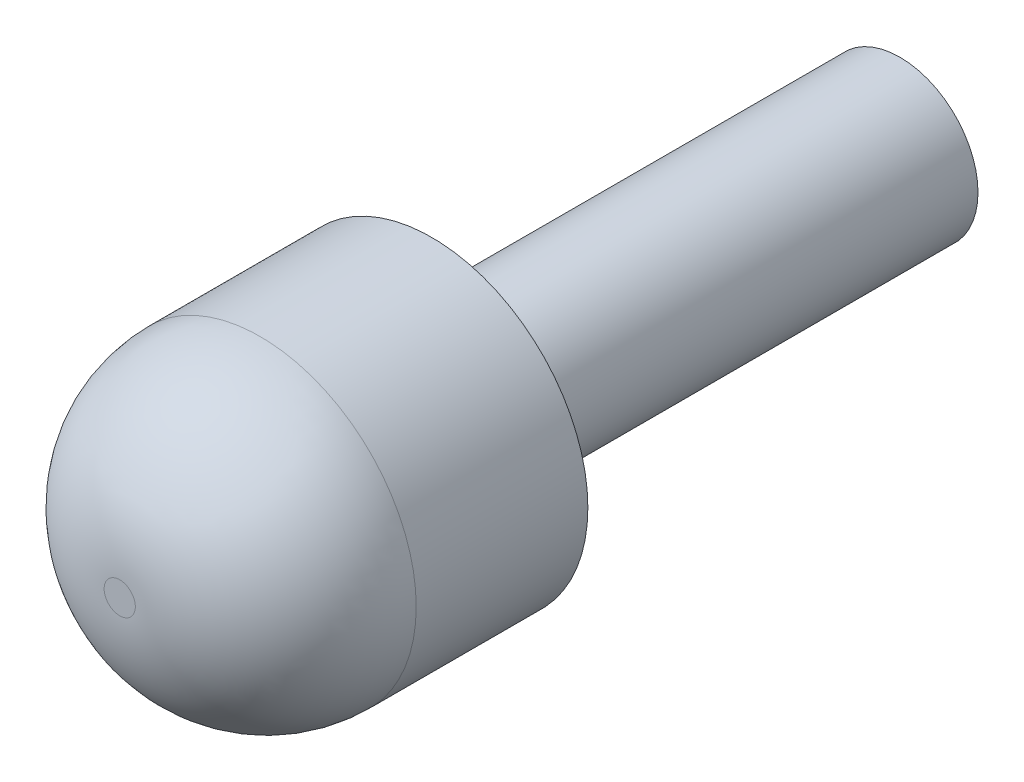
ISO-10303-21;
HEADER;
FILE_DESCRIPTION(('STEP AP214'),'2;1');
FILE_NAME('part.step','',(''),(''),'','','');
FILE_SCHEMA(('AUTOMOTIVE_DESIGN { 1 0 10303 214 1 1 1 1 }'));
ENDSEC;
DATA;
#1=APPLICATION_CONTEXT('core data for automotive mechanical design processes');
#2=APPLICATION_PROTOCOL_DEFINITION('international standard','automotive_design',2000,#1);
#3=PRODUCT_CONTEXT('',#1,'mechanical');
#4=PRODUCT('Part','Part','',(#3));
#5=PRODUCT_RELATED_PRODUCT_CATEGORY('part','',(#4));
#6=PRODUCT_DEFINITION_FORMATION('','',#4);
#7=PRODUCT_DEFINITION_CONTEXT('part definition',#1,'design');
#8=PRODUCT_DEFINITION('design','',#6,#7);
#9=PRODUCT_DEFINITION_SHAPE('','',#8);
#10=(LENGTH_UNIT() NAMED_UNIT(*) SI_UNIT(.MILLI.,.METRE.));
#11=(NAMED_UNIT(*) PLANE_ANGLE_UNIT() SI_UNIT($,.RADIAN.));
#12=(NAMED_UNIT(*) SI_UNIT($,.STERADIAN.) SOLID_ANGLE_UNIT());
#13=UNCERTAINTY_MEASURE_WITH_UNIT(LENGTH_MEASURE(1.E-05),#10,'distance_accuracy_value','');
#14=(GEOMETRIC_REPRESENTATION_CONTEXT(3) GLOBAL_UNCERTAINTY_ASSIGNED_CONTEXT((#13)) GLOBAL_UNIT_ASSIGNED_CONTEXT((#10,
#11,#12)) REPRESENTATION_CONTEXT('',''));
#15=CARTESIAN_POINT('',(0.,0.,0.));
#16=DIRECTION('',(0.,0.,1.));
#17=DIRECTION('',(1.,0.,0.));
#18=AXIS2_PLACEMENT_3D('',#15,#16,#17);
#19=CARTESIAN_POINT('',(0.,0.,-4.));
#20=DIRECTION('',(0.,0.,1.));
#21=DIRECTION('',(1.,0.,0.));
#22=AXIS2_PLACEMENT_3D('',#19,#20,#21);
#23=PLANE('',#22);
#24=CARTESIAN_POINT('',(0.,0.,-4.));
#25=DIRECTION('',(0.,0.,1.));
#26=DIRECTION('',(1.,0.,0.));
#27=AXIS2_PLACEMENT_3D('',#24,#25,#26);
#28=CIRCLE('',#27,2.);
#29=CARTESIAN_POINT('',(2.,0.,-4.));
#30=VERTEX_POINT('',#29);
#31=EDGE_CURVE('E117',#30,#30,#28,.T.);
#32=ORIENTED_EDGE('',*,*,#31,.F.);
#33=EDGE_LOOP('',(#32));
#34=FACE_BOUND('',#33,.T.);
#35=CARTESIAN_POINT('',(0.,0.,-4.));
#36=DIRECTION('',(0.,0.,1.));
#37=DIRECTION('',(1.,0.,0.));
#38=AXIS2_PLACEMENT_3D('',#35,#36,#37);
#39=CIRCLE('',#38,1.);
#40=CARTESIAN_POINT('',(1.,0.,-4.));
#41=VERTEX_POINT('',#40);
#42=EDGE_CURVE('E11',#41,#41,#39,.F.);
#43=ORIENTED_EDGE('',*,*,#42,.F.);
#44=EDGE_LOOP('',(#43));
#45=FACE_BOUND('',#44,.T.);
#46=ADVANCED_FACE('F36',(#34,#45),#23,.F.);
#47=CARTESIAN_POINT('',(0.,0.,-4.));
#48=DIRECTION('',(0.,0.,1.));
#49=DIRECTION('',(1.,0.,0.));
#50=AXIS2_PLACEMENT_3D('',#47,#48,#49);
#51=CYLINDRICAL_SURFACE('',#50,2.);
#52=CARTESIAN_POINT('',(0.,0.,-1.8));
#53=DIRECTION('',(0.,0.,1.));
#54=DIRECTION('',(1.,0.,0.));
#55=AXIS2_PLACEMENT_3D('',#52,#53,#54);
#56=CIRCLE('',#55,2.);
#57=CARTESIAN_POINT('',(2.,0.,-1.8));
#58=VERTEX_POINT('',#57);
#59=EDGE_CURVE('E44',#58,#58,#56,.F.);
#60=ORIENTED_EDGE('',*,*,#59,.T.);
#61=EDGE_LOOP('',(#60));
#62=FACE_BOUND('',#61,.T.);
#63=ORIENTED_EDGE('',*,*,#31,.T.);
#64=EDGE_LOOP('',(#63));
#65=FACE_BOUND('',#64,.T.);
#66=ADVANCED_FACE('F125',(#62,#65),#51,.T.);
#67=CARTESIAN_POINT('',(0.,0.,0.));
#68=DIRECTION('',(0.,0.,1.));
#69=DIRECTION('',(1.,0.,0.));
#70=AXIS2_PLACEMENT_3D('',#67,#68,#69);
#71=PLANE('',#70);
#72=CARTESIAN_POINT('',(0.,0.,0.));
#73=DIRECTION('',(0.,0.,1.));
#74=DIRECTION('',(1.,0.,0.));
#75=AXIS2_PLACEMENT_3D('',#72,#73,#74);
#76=CIRCLE('',#75,0.2);
#77=CARTESIAN_POINT('',(0.2,0.,0.));
#78=VERTEX_POINT('',#77);
#79=EDGE_CURVE('E120',#78,#78,#76,.T.);
#80=ORIENTED_EDGE('',*,*,#79,.T.);
#81=EDGE_LOOP('',(#80));
#82=FACE_BOUND('',#81,.T.);
#83=ADVANCED_FACE('F131',(#82),#71,.T.);
#84=CARTESIAN_POINT('',(0.,0.,-1.8));
#85=DIRECTION('',(0.,0.,1.));
#86=DIRECTION('',(1.,0.,0.));
#87=AXIS2_PLACEMENT_3D('',#84,#85,#86);
#88=DEGENERATE_TOROIDAL_SURFACE('',#87,0.2,1.8,.T.);
#89=ORIENTED_EDGE('',*,*,#59,.F.);
#90=EDGE_LOOP('',(#89));
#91=FACE_BOUND('',#90,.T.);
#92=ORIENTED_EDGE('',*,*,#79,.F.);
#93=EDGE_LOOP('',(#92));
#94=FACE_BOUND('',#93,.T.);
#95=ADVANCED_FACE('F38',(#91,#94),#88,.T.);
#96=CARTESIAN_POINT('',(0.,0.,-10.));
#97=DIRECTION('',(0.,0.,1.));
#98=DIRECTION('',(1.,0.,0.));
#99=AXIS2_PLACEMENT_3D('',#96,#97,#98);
#100=CYLINDRICAL_SURFACE('',#99,1.);
#101=CARTESIAN_POINT('',(0.,0.,-10.));
#102=DIRECTION('',(0.,0.,-1.));
#103=DIRECTION('',(-1.,0.,0.));
#104=AXIS2_PLACEMENT_3D('',#101,#102,#103);
#105=CIRCLE('',#104,1.);
#106=CARTESIAN_POINT('',(-1.,0.,-10.));
#107=VERTEX_POINT('',#106);
#108=EDGE_CURVE('E112',#107,#107,#105,.T.);
#109=ORIENTED_EDGE('',*,*,#108,.F.);
#110=EDGE_LOOP('',(#109));
#111=FACE_BOUND('',#110,.T.);
#112=ORIENTED_EDGE('',*,*,#42,.T.);
#113=EDGE_LOOP('',(#112));
#114=FACE_BOUND('',#113,.T.);
#115=ADVANCED_FACE('F130',(#111,#114),#100,.T.);
#116=CARTESIAN_POINT('',(0.,0.,-10.));
#117=DIRECTION('',(0.,0.,-1.));
#118=DIRECTION('',(-1.,0.,0.));
#119=AXIS2_PLACEMENT_3D('',#116,#117,#118);
#120=PLANE('',#119);
#121=DIRECTION('',(0.,-1.,0.));
#122=VECTOR('',#121,1.);
#123=CARTESIAN_POINT('',(0.5,-0.5,-10.));
#124=LINE('',#123,#122);
#125=CARTESIAN_POINT('',(0.5,0.5,-10.));
#126=VERTEX_POINT('',#125);
#127=CARTESIAN_POINT('',(0.5,-0.5,-10.));
#128=VERTEX_POINT('',#127);
#129=EDGE_CURVE('E51',#126,#128,#124,.T.);
#130=ORIENTED_EDGE('',*,*,#129,.F.);
#131=DIRECTION('',(1.,0.,0.));
#132=VECTOR('',#131,1.);
#133=CARTESIAN_POINT('',(0.5,0.5,-10.));
#134=LINE('',#133,#132);
#135=CARTESIAN_POINT('',(-0.5,0.5,-10.));
#136=VERTEX_POINT('',#135);
#137=EDGE_CURVE('E102',#136,#126,#134,.T.);
#138=ORIENTED_EDGE('',*,*,#137,.F.);
#139=DIRECTION('',(0.,1.,0.));
#140=VECTOR('',#139,1.);
#141=CARTESIAN_POINT('',(-0.5,-0.5,-10.));
#142=LINE('',#141,#140);
#143=CARTESIAN_POINT('',(-0.5,-0.5,-10.));
#144=VERTEX_POINT('',#143);
#145=EDGE_CURVE('E108',#144,#136,#142,.T.);
#146=ORIENTED_EDGE('',*,*,#145,.F.);
#147=DIRECTION('',(-1.,0.,0.));
#148=VECTOR('',#147,1.);
#149=CARTESIAN_POINT('',(0.5,-0.5,-10.));
#150=LINE('',#149,#148);
#151=EDGE_CURVE('E86',#128,#144,#150,.T.);
#152=ORIENTED_EDGE('',*,*,#151,.F.);
#153=EDGE_LOOP('',(#130,#138,#146,#152));
#154=FACE_BOUND('',#153,.T.);
#155=ORIENTED_EDGE('',*,*,#108,.T.);
#156=EDGE_LOOP('',(#155));
#157=FACE_BOUND('',#156,.T.);
#158=ADVANCED_FACE('F149',(#154,#157),#120,.T.);
#159=CARTESIAN_POINT('',(0.5,-0.5,-9.));
#160=DIRECTION('',(1.,0.,0.));
#161=DIRECTION('',(0.,0.,-1.));
#162=AXIS2_PLACEMENT_3D('',#159,#160,#161);
#163=PLANE('',#162);
#164=ORIENTED_EDGE('',*,*,#129,.T.);
#165=DIRECTION('',(0.,0.,-1.));
#166=VECTOR('',#165,1.);
#167=CARTESIAN_POINT('',(0.5,-0.5,-9.));
#168=LINE('',#167,#166);
#169=CARTESIAN_POINT('',(0.5,-0.5,-9.));
#170=VERTEX_POINT('',#169);
#171=EDGE_CURVE('E74',#170,#128,#168,.T.);
#172=ORIENTED_EDGE('',*,*,#171,.F.);
#173=DIRECTION('',(0.,-1.,0.));
#174=VECTOR('',#173,1.);
#175=CARTESIAN_POINT('',(0.5,-0.5,-9.));
#176=LINE('',#175,#174);
#177=CARTESIAN_POINT('',(0.5,0.5,-9.));
#178=VERTEX_POINT('',#177);
#179=EDGE_CURVE('E100',#178,#170,#176,.T.);
#180=ORIENTED_EDGE('',*,*,#179,.F.);
#181=DIRECTION('',(0.,0.,-1.));
#182=VECTOR('',#181,1.);
#183=CARTESIAN_POINT('',(0.5,0.5,-9.));
#184=LINE('',#183,#182);
#185=EDGE_CURVE('E59',#178,#126,#184,.T.);
#186=ORIENTED_EDGE('',*,*,#185,.T.);
#187=EDGE_LOOP('',(#164,#172,#180,#186));
#188=FACE_BOUND('',#187,.T.);
#189=ADVANCED_FACE('F153',(#188),#163,.F.);
#190=CARTESIAN_POINT('',(0.5,0.5,-9.));
#191=DIRECTION('',(0.,1.,0.));
#192=DIRECTION('',(0.,0.,1.));
#193=AXIS2_PLACEMENT_3D('',#190,#191,#192);
#194=PLANE('',#193);
#195=ORIENTED_EDGE('',*,*,#137,.T.);
#196=ORIENTED_EDGE('',*,*,#185,.F.);
#197=DIRECTION('',(1.,0.,0.));
#198=VECTOR('',#197,1.);
#199=CARTESIAN_POINT('',(0.5,0.5,-9.));
#200=LINE('',#199,#198);
#201=CARTESIAN_POINT('',(-0.5,0.5,-9.));
#202=VERTEX_POINT('',#201);
#203=EDGE_CURVE('E97',#202,#178,#200,.T.);
#204=ORIENTED_EDGE('',*,*,#203,.F.);
#205=DIRECTION('',(0.,0.,-1.));
#206=VECTOR('',#205,1.);
#207=CARTESIAN_POINT('',(-0.5,0.5,-9.));
#208=LINE('',#207,#206);
#209=EDGE_CURVE('E90',#202,#136,#208,.T.);
#210=ORIENTED_EDGE('',*,*,#209,.T.);
#211=EDGE_LOOP('',(#195,#196,#204,#210));
#212=FACE_BOUND('',#211,.T.);
#213=ADVANCED_FACE('F157',(#212),#194,.F.);
#214=CARTESIAN_POINT('',(-0.5,-0.5,-9.));
#215=DIRECTION('',(-1.,0.,0.));
#216=DIRECTION('',(0.,0.,1.));
#217=AXIS2_PLACEMENT_3D('',#214,#215,#216);
#218=PLANE('',#217);
#219=ORIENTED_EDGE('',*,*,#145,.T.);
#220=ORIENTED_EDGE('',*,*,#209,.F.);
#221=DIRECTION('',(0.,1.,0.));
#222=VECTOR('',#221,1.);
#223=CARTESIAN_POINT('',(-0.5,-0.5,-9.));
#224=LINE('',#223,#222);
#225=CARTESIAN_POINT('',(-0.5,-0.5,-9.));
#226=VERTEX_POINT('',#225);
#227=EDGE_CURVE('E93',#226,#202,#224,.T.);
#228=ORIENTED_EDGE('',*,*,#227,.F.);
#229=DIRECTION('',(0.,0.,-1.));
#230=VECTOR('',#229,1.);
#231=CARTESIAN_POINT('',(-0.5,-0.5,-9.));
#232=LINE('',#231,#230);
#233=EDGE_CURVE('E79',#226,#144,#232,.T.);
#234=ORIENTED_EDGE('',*,*,#233,.T.);
#235=EDGE_LOOP('',(#219,#220,#228,#234));
#236=FACE_BOUND('',#235,.T.);
#237=ADVANCED_FACE('F94',(#236),#218,.F.);
#238=CARTESIAN_POINT('',(0.5,-0.5,-9.));
#239=DIRECTION('',(0.,-1.,0.));
#240=DIRECTION('',(0.,0.,-1.));
#241=AXIS2_PLACEMENT_3D('',#238,#239,#240);
#242=PLANE('',#241);
#243=ORIENTED_EDGE('',*,*,#151,.T.);
#244=ORIENTED_EDGE('',*,*,#233,.F.);
#245=DIRECTION('',(-1.,0.,0.));
#246=VECTOR('',#245,1.);
#247=CARTESIAN_POINT('',(0.5,-0.5,-9.));
#248=LINE('',#247,#246);
#249=EDGE_CURVE('E83',#170,#226,#248,.T.);
#250=ORIENTED_EDGE('',*,*,#249,.F.);
#251=ORIENTED_EDGE('',*,*,#171,.T.);
#252=EDGE_LOOP('',(#243,#244,#250,#251));
#253=FACE_BOUND('',#252,.T.);
#254=ADVANCED_FACE('F81',(#253),#242,.F.);
#255=CARTESIAN_POINT('',(0.5,0.5,-9.));
#256=DIRECTION('',(0.,0.,1.));
#257=DIRECTION('',(1.,0.,0.));
#258=AXIS2_PLACEMENT_3D('',#255,#256,#257);
#259=PLANE('',#258);
#260=ORIENTED_EDGE('',*,*,#179,.T.);
#261=ORIENTED_EDGE('',*,*,#249,.T.);
#262=ORIENTED_EDGE('',*,*,#227,.T.);
#263=ORIENTED_EDGE('',*,*,#203,.T.);
#264=EDGE_LOOP('',(#260,#261,#262,#263));
#265=FACE_BOUND('',#264,.T.);
#266=ADVANCED_FACE('F99',(#265),#259,.F.);
#267=CLOSED_SHELL('',(#46,#66,#83,#95,#115,#158,#189,#213,#237,#254,#266));
#268=MANIFOLD_SOLID_BREP('B2',#267);
#269=ADVANCED_BREP_SHAPE_REPRESENTATION('',(#18,#268),#14);
#270=SHAPE_DEFINITION_REPRESENTATION(#9,#269);
ENDSEC;
END-ISO-10303-21;
